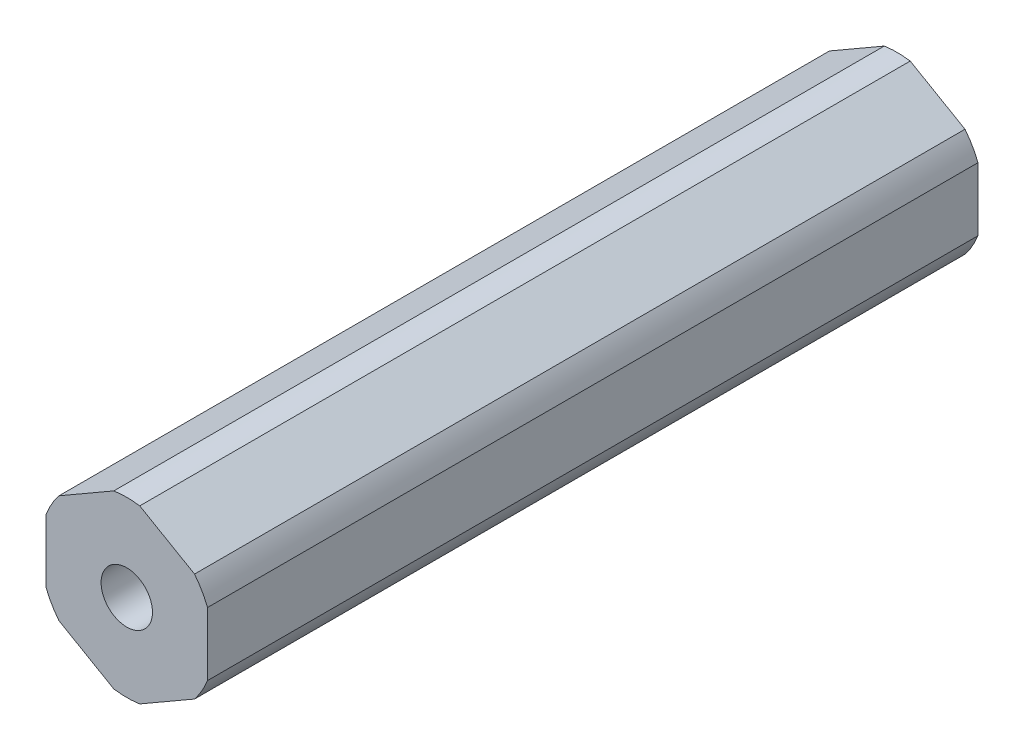
ISO-10303-21;
HEADER;
FILE_DESCRIPTION(('STEP AP214'),'2;1');
FILE_NAME('part.step','',(''),(''),'','','');
FILE_SCHEMA(('AUTOMOTIVE_DESIGN { 1 0 10303 214 1 1 1 1 }'));
ENDSEC;
DATA;
#1=APPLICATION_CONTEXT('core data for automotive mechanical design processes');
#2=APPLICATION_PROTOCOL_DEFINITION('international standard','automotive_design',2000,#1);
#3=PRODUCT_CONTEXT('',#1,'mechanical');
#4=PRODUCT('Part','Part','',(#3));
#5=PRODUCT_RELATED_PRODUCT_CATEGORY('part','',(#4));
#6=PRODUCT_DEFINITION_FORMATION('','',#4);
#7=PRODUCT_DEFINITION_CONTEXT('part definition',#1,'design');
#8=PRODUCT_DEFINITION('design','',#6,#7);
#9=PRODUCT_DEFINITION_SHAPE('','',#8);
#10=(LENGTH_UNIT() NAMED_UNIT(*) SI_UNIT(.MILLI.,.METRE.));
#11=(NAMED_UNIT(*) PLANE_ANGLE_UNIT() SI_UNIT($,.RADIAN.));
#12=(NAMED_UNIT(*) SI_UNIT($,.STERADIAN.) SOLID_ANGLE_UNIT());
#13=UNCERTAINTY_MEASURE_WITH_UNIT(LENGTH_MEASURE(1.E-05),#10,'distance_accuracy_value','');
#14=(GEOMETRIC_REPRESENTATION_CONTEXT(3) GLOBAL_UNCERTAINTY_ASSIGNED_CONTEXT((#13)) GLOBAL_UNIT_ASSIGNED_CONTEXT((#10,
#11,#12)) REPRESENTATION_CONTEXT('',''));
#15=CARTESIAN_POINT('',(0.,0.,0.));
#16=DIRECTION('',(0.,0.,1.));
#17=DIRECTION('',(1.,0.,0.));
#18=AXIS2_PLACEMENT_3D('',#15,#16,#17);
#19=CARTESIAN_POINT('',(6.35,0.,30.2895));
#20=DIRECTION('',(-1.,0.,0.));
#21=DIRECTION('',(0.,0.,1.));
#22=AXIS2_PLACEMENT_3D('',#19,#20,#21);
#23=PLANE('',#22);
#24=DIRECTION('',(0.,1.,0.));
#25=VECTOR('',#24,1.);
#26=CARTESIAN_POINT('',(6.35,0.,-30.2895));
#27=LINE('',#26,#25);
#28=CARTESIAN_POINT('',(6.35,-2.48767682989571,-30.2895));
#29=VERTEX_POINT('',#28);
#30=CARTESIAN_POINT('',(6.35,2.48767682989571,-30.2895));
#31=VERTEX_POINT('',#30);
#32=EDGE_CURVE('E177',#29,#31,#27,.T.);
#33=ORIENTED_EDGE('',*,*,#32,.T.);
#34=DIRECTION('',(0.,0.,-1.));
#35=VECTOR('',#34,1.);
#36=CARTESIAN_POINT('',(6.35,2.48767682989571,30.2895));
#37=LINE('',#36,#35);
#38=CARTESIAN_POINT('',(6.35,2.48767682989571,30.2895));
#39=VERTEX_POINT('',#38);
#40=EDGE_CURVE('E11',#39,#31,#37,.T.);
#41=ORIENTED_EDGE('',*,*,#40,.F.);
#42=DIRECTION('',(0.,1.,0.));
#43=VECTOR('',#42,1.);
#44=CARTESIAN_POINT('',(6.35,0.,30.2895));
#45=LINE('',#44,#43);
#46=CARTESIAN_POINT('',(6.35,-2.48767682989571,30.2895));
#47=VERTEX_POINT('',#46);
#48=EDGE_CURVE('E235',#47,#39,#45,.T.);
#49=ORIENTED_EDGE('',*,*,#48,.F.);
#50=DIRECTION('',(0.,0.,-1.));
#51=VECTOR('',#50,1.);
#52=CARTESIAN_POINT('',(6.35,-2.48767682989571,30.2895));
#53=LINE('',#52,#51);
#54=EDGE_CURVE('E173',#47,#29,#53,.T.);
#55=ORIENTED_EDGE('',*,*,#54,.T.);
#56=EDGE_LOOP('',(#33,#41,#49,#55));
#57=FACE_BOUND('',#56,.T.);
#58=ADVANCED_FACE('F53',(#57),#23,.F.);
#59=CARTESIAN_POINT('',(0.,0.,30.2895));
#60=DIRECTION('',(0.,0.,-1.));
#61=DIRECTION('',(-1.,0.,0.));
#62=AXIS2_PLACEMENT_3D('',#59,#60,#61);
#63=CYLINDRICAL_SURFACE('',#62,6.8199);
#64=CARTESIAN_POINT('',(0.,0.,-30.2895));
#65=DIRECTION('',(0.,0.,1.));
#66=DIRECTION('',(1.,0.,0.));
#67=AXIS2_PLACEMENT_3D('',#64,#65,#66);
#68=CIRCLE('',#67,6.8199);
#69=CARTESIAN_POINT('',(5.32939133109563,4.25542289908333,-30.2895));
#70=VERTEX_POINT('',#69);
#71=EDGE_CURVE('E180',#31,#70,#68,.T.);
#72=ORIENTED_EDGE('',*,*,#71,.T.);
#73=DIRECTION('',(0.,0.,-1.));
#74=VECTOR('',#73,1.);
#75=CARTESIAN_POINT('',(5.32939133109563,4.25542289908333,30.2895));
#76=LINE('',#75,#74);
#77=CARTESIAN_POINT('',(5.32939133109563,4.25542289908333,30.2895));
#78=VERTEX_POINT('',#77);
#79=EDGE_CURVE('E61',#78,#70,#76,.T.);
#80=ORIENTED_EDGE('',*,*,#79,.F.);
#81=CARTESIAN_POINT('',(0.,0.,30.2895));
#82=DIRECTION('',(0.,0.,1.));
#83=DIRECTION('',(1.,0.,0.));
#84=AXIS2_PLACEMENT_3D('',#81,#82,#83);
#85=CIRCLE('',#84,6.8199);
#86=EDGE_CURVE('E125',#39,#78,#85,.T.);
#87=ORIENTED_EDGE('',*,*,#86,.F.);
#88=ORIENTED_EDGE('',*,*,#40,.T.);
#89=EDGE_LOOP('',(#72,#80,#87,#88));
#90=FACE_BOUND('',#89,.T.);
#91=ADVANCED_FACE('F269',(#90),#63,.T.);
#92=CARTESIAN_POINT('',(3.175,5.49926131403119,30.2895));
#93=DIRECTION('',(-0.5,-0.866025403784438,0.));
#94=DIRECTION('',(0.866025403784439,-0.5,0.));
#95=AXIS2_PLACEMENT_3D('',#92,#93,#94);
#96=PLANE('',#95);
#97=DIRECTION('',(-0.866025403784439,0.5,0.));
#98=VECTOR('',#97,1.);
#99=CARTESIAN_POINT('',(3.175,5.49926131403119,-30.2895));
#100=LINE('',#99,#98);
#101=CARTESIAN_POINT('',(1.02060866890438,6.74309972897904,-30.2895));
#102=VERTEX_POINT('',#101);
#103=EDGE_CURVE('E183',#70,#102,#100,.T.);
#104=ORIENTED_EDGE('',*,*,#103,.T.);
#105=DIRECTION('',(0.,0.,-1.));
#106=VECTOR('',#105,1.);
#107=CARTESIAN_POINT('',(1.02060866890438,6.74309972897904,30.2895));
#108=LINE('',#107,#106);
#109=CARTESIAN_POINT('',(1.02060866890438,6.74309972897904,30.2895));
#110=VERTEX_POINT('',#109);
#111=EDGE_CURVE('E213',#110,#102,#108,.T.);
#112=ORIENTED_EDGE('',*,*,#111,.F.);
#113=DIRECTION('',(-0.866025403784439,0.5,0.));
#114=VECTOR('',#113,1.);
#115=CARTESIAN_POINT('',(3.175,5.49926131403119,30.2895));
#116=LINE('',#115,#114);
#117=EDGE_CURVE('E221',#78,#110,#116,.T.);
#118=ORIENTED_EDGE('',*,*,#117,.F.);
#119=ORIENTED_EDGE('',*,*,#79,.T.);
#120=EDGE_LOOP('',(#104,#112,#118,#119));
#121=FACE_BOUND('',#120,.T.);
#122=ADVANCED_FACE('F219',(#121),#96,.F.);
#123=CARTESIAN_POINT('',(-1.02060866890437,6.74309972897904,-30.2895));
#124=VERTEX_POINT('',#123);
#125=EDGE_CURVE('E184',#102,#124,#68,.T.);
#126=ORIENTED_EDGE('',*,*,#125,.T.);
#127=DIRECTION('',(0.,0.,-1.));
#128=VECTOR('',#127,1.);
#129=CARTESIAN_POINT('',(-1.02060866890437,6.74309972897904,30.2895));
#130=LINE('',#129,#128);
#131=CARTESIAN_POINT('',(-1.02060866890437,6.74309972897904,30.2895));
#132=VERTEX_POINT('',#131);
#133=EDGE_CURVE('E210',#132,#124,#130,.T.);
#134=ORIENTED_EDGE('',*,*,#133,.F.);
#135=EDGE_CURVE('E239',#110,#132,#85,.T.);
#136=ORIENTED_EDGE('',*,*,#135,.F.);
#137=ORIENTED_EDGE('',*,*,#111,.T.);
#138=EDGE_LOOP('',(#126,#134,#136,#137));
#139=FACE_BOUND('',#138,.T.);
#140=ADVANCED_FACE('F253',(#139),#63,.T.);
#141=CARTESIAN_POINT('',(-3.175,5.49926131403118,30.2895));
#142=DIRECTION('',(0.5,-0.866025403784438,0.));
#143=DIRECTION('',(0.866025403784439,0.5,0.));
#144=AXIS2_PLACEMENT_3D('',#141,#142,#143);
#145=PLANE('',#144);
#146=DIRECTION('',(-0.866025403784438,-0.5,0.));
#147=VECTOR('',#146,1.);
#148=CARTESIAN_POINT('',(-3.175,5.49926131403118,-30.2895));
#149=LINE('',#148,#147);
#150=CARTESIAN_POINT('',(-5.32939133109563,4.25542289908332,-30.2895));
#151=VERTEX_POINT('',#150);
#152=EDGE_CURVE('E186',#124,#151,#149,.T.);
#153=ORIENTED_EDGE('',*,*,#152,.T.);
#154=DIRECTION('',(0.,0.,-1.));
#155=VECTOR('',#154,1.);
#156=CARTESIAN_POINT('',(-5.32939133109563,4.25542289908332,30.2895));
#157=LINE('',#156,#155);
#158=CARTESIAN_POINT('',(-5.32939133109563,4.25542289908332,30.2895));
#159=VERTEX_POINT('',#158);
#160=EDGE_CURVE('E207',#159,#151,#157,.T.);
#161=ORIENTED_EDGE('',*,*,#160,.F.);
#162=DIRECTION('',(-0.866025403784438,-0.5,0.));
#163=VECTOR('',#162,1.);
#164=CARTESIAN_POINT('',(-3.175,5.49926131403118,30.2895));
#165=LINE('',#164,#163);
#166=EDGE_CURVE('E244',#132,#159,#165,.T.);
#167=ORIENTED_EDGE('',*,*,#166,.F.);
#168=ORIENTED_EDGE('',*,*,#133,.T.);
#169=EDGE_LOOP('',(#153,#161,#167,#168));
#170=FACE_BOUND('',#169,.T.);
#171=ADVANCED_FACE('F255',(#170),#145,.F.);
#172=CARTESIAN_POINT('',(-6.35,2.48767682989571,-30.2895));
#173=VERTEX_POINT('',#172);
#174=EDGE_CURVE('E188',#151,#173,#68,.T.);
#175=ORIENTED_EDGE('',*,*,#174,.T.);
#176=DIRECTION('',(0.,0.,-1.));
#177=VECTOR('',#176,1.);
#178=CARTESIAN_POINT('',(-6.35,2.48767682989571,30.2895));
#179=LINE('',#178,#177);
#180=CARTESIAN_POINT('',(-6.35,2.48767682989571,30.2895));
#181=VERTEX_POINT('',#180);
#182=EDGE_CURVE('E204',#181,#173,#179,.T.);
#183=ORIENTED_EDGE('',*,*,#182,.F.);
#184=EDGE_CURVE('E245',#159,#181,#85,.T.);
#185=ORIENTED_EDGE('',*,*,#184,.F.);
#186=ORIENTED_EDGE('',*,*,#160,.T.);
#187=EDGE_LOOP('',(#175,#183,#185,#186));
#188=FACE_BOUND('',#187,.T.);
#189=ADVANCED_FACE('F256',(#188),#63,.T.);
#190=CARTESIAN_POINT('',(-6.35,0.,30.2895));
#191=DIRECTION('',(1.,0.,0.));
#192=DIRECTION('',(0.,1.,0.));
#193=AXIS2_PLACEMENT_3D('',#190,#191,#192);
#194=PLANE('',#193);
#195=DIRECTION('',(0.,-1.,0.));
#196=VECTOR('',#195,1.);
#197=CARTESIAN_POINT('',(-6.35,0.,-30.2895));
#198=LINE('',#197,#196);
#199=CARTESIAN_POINT('',(-6.35,-2.48767682989572,-30.2895));
#200=VERTEX_POINT('',#199);
#201=EDGE_CURVE('E189',#173,#200,#198,.T.);
#202=ORIENTED_EDGE('',*,*,#201,.T.);
#203=DIRECTION('',(0.,0.,-1.));
#204=VECTOR('',#203,1.);
#205=CARTESIAN_POINT('',(-6.35,-2.48767682989572,30.2895));
#206=LINE('',#205,#204);
#207=CARTESIAN_POINT('',(-6.35,-2.48767682989572,30.2895));
#208=VERTEX_POINT('',#207);
#209=EDGE_CURVE('E201',#208,#200,#206,.T.);
#210=ORIENTED_EDGE('',*,*,#209,.F.);
#211=DIRECTION('',(0.,-1.,0.));
#212=VECTOR('',#211,1.);
#213=CARTESIAN_POINT('',(-6.35,0.,30.2895));
#214=LINE('',#213,#212);
#215=EDGE_CURVE('E246',#181,#208,#214,.T.);
#216=ORIENTED_EDGE('',*,*,#215,.F.);
#217=ORIENTED_EDGE('',*,*,#182,.T.);
#218=EDGE_LOOP('',(#202,#210,#216,#217));
#219=FACE_BOUND('',#218,.T.);
#220=ADVANCED_FACE('F259',(#219),#194,.F.);
#221=CARTESIAN_POINT('',(-5.32939133109563,-4.25542289908334,-30.2895));
#222=VERTEX_POINT('',#221);
#223=EDGE_CURVE('E191',#200,#222,#68,.T.);
#224=ORIENTED_EDGE('',*,*,#223,.T.);
#225=DIRECTION('',(0.,0.,-1.));
#226=VECTOR('',#225,1.);
#227=CARTESIAN_POINT('',(-5.32939133109563,-4.25542289908334,30.2895));
#228=LINE('',#227,#226);
#229=CARTESIAN_POINT('',(-5.32939133109563,-4.25542289908334,30.2895));
#230=VERTEX_POINT('',#229);
#231=EDGE_CURVE('E198',#230,#222,#228,.T.);
#232=ORIENTED_EDGE('',*,*,#231,.F.);
#233=EDGE_CURVE('E163',#208,#230,#85,.T.);
#234=ORIENTED_EDGE('',*,*,#233,.F.);
#235=ORIENTED_EDGE('',*,*,#209,.T.);
#236=EDGE_LOOP('',(#224,#232,#234,#235));
#237=FACE_BOUND('',#236,.T.);
#238=ADVANCED_FACE('F261',(#237),#63,.T.);
#239=CARTESIAN_POINT('',(-3.175,-5.49926131403119,30.2895));
#240=DIRECTION('',(0.5,0.866025403784439,0.));
#241=DIRECTION('',(-0.866025403784439,0.5,0.));
#242=AXIS2_PLACEMENT_3D('',#239,#240,#241);
#243=PLANE('',#242);
#244=DIRECTION('',(0.866025403784439,-0.5,0.));
#245=VECTOR('',#244,1.);
#246=CARTESIAN_POINT('',(-3.175,-5.49926131403119,-30.2895));
#247=LINE('',#246,#245);
#248=CARTESIAN_POINT('',(-1.02060866890438,-6.74309972897904,-30.2895));
#249=VERTEX_POINT('',#248);
#250=EDGE_CURVE('E192',#222,#249,#247,.T.);
#251=ORIENTED_EDGE('',*,*,#250,.T.);
#252=DIRECTION('',(0.,0.,-1.));
#253=VECTOR('',#252,1.);
#254=CARTESIAN_POINT('',(-1.02060866890438,-6.74309972897904,30.2895));
#255=LINE('',#254,#253);
#256=CARTESIAN_POINT('',(-1.02060866890438,-6.74309972897904,30.2895));
#257=VERTEX_POINT('',#256);
#258=EDGE_CURVE('E168',#257,#249,#255,.T.);
#259=ORIENTED_EDGE('',*,*,#258,.F.);
#260=DIRECTION('',(0.866025403784439,-0.5,0.));
#261=VECTOR('',#260,1.);
#262=CARTESIAN_POINT('',(-3.175,-5.49926131403119,30.2895));
#263=LINE('',#262,#261);
#264=EDGE_CURVE('E158',#230,#257,#263,.T.);
#265=ORIENTED_EDGE('',*,*,#264,.F.);
#266=ORIENTED_EDGE('',*,*,#231,.T.);
#267=EDGE_LOOP('',(#251,#259,#265,#266));
#268=FACE_BOUND('',#267,.T.);
#269=ADVANCED_FACE('F264',(#268),#243,.F.);
#270=CARTESIAN_POINT('',(1.02060866890438,-6.74309972897904,-30.2895));
#271=VERTEX_POINT('',#270);
#272=EDGE_CURVE('E167',#249,#271,#68,.T.);
#273=ORIENTED_EDGE('',*,*,#272,.T.);
#274=DIRECTION('',(0.,0.,-1.));
#275=VECTOR('',#274,1.);
#276=CARTESIAN_POINT('',(1.02060866890438,-6.74309972897904,30.2895));
#277=LINE('',#276,#275);
#278=CARTESIAN_POINT('',(1.02060866890438,-6.74309972897904,30.2895));
#279=VERTEX_POINT('',#278);
#280=EDGE_CURVE('E164',#279,#271,#277,.T.);
#281=ORIENTED_EDGE('',*,*,#280,.F.);
#282=EDGE_CURVE('E152',#257,#279,#85,.T.);
#283=ORIENTED_EDGE('',*,*,#282,.F.);
#284=ORIENTED_EDGE('',*,*,#258,.T.);
#285=EDGE_LOOP('',(#273,#281,#283,#284));
#286=FACE_BOUND('',#285,.T.);
#287=ADVANCED_FACE('F165',(#286),#63,.T.);
#288=CARTESIAN_POINT('',(3.175,-5.49926131403119,30.2895));
#289=DIRECTION('',(-0.5,0.866025403784438,0.));
#290=DIRECTION('',(-0.866025403784439,-0.5,0.));
#291=AXIS2_PLACEMENT_3D('',#288,#289,#290);
#292=PLANE('',#291);
#293=DIRECTION('',(0.866025403784438,0.5,0.));
#294=VECTOR('',#293,1.);
#295=CARTESIAN_POINT('',(3.175,-5.49926131403119,-30.2895));
#296=LINE('',#295,#294);
#297=CARTESIAN_POINT('',(5.32939133109563,-4.25542289908333,-30.2895));
#298=VERTEX_POINT('',#297);
#299=EDGE_CURVE('E111',#271,#298,#296,.T.);
#300=ORIENTED_EDGE('',*,*,#299,.T.);
#301=DIRECTION('',(0.,0.,-1.));
#302=VECTOR('',#301,1.);
#303=CARTESIAN_POINT('',(5.32939133109563,-4.25542289908333,30.2895));
#304=LINE('',#303,#302);
#305=CARTESIAN_POINT('',(5.32939133109563,-4.25542289908333,30.2895));
#306=VERTEX_POINT('',#305);
#307=EDGE_CURVE('E169',#306,#298,#304,.T.);
#308=ORIENTED_EDGE('',*,*,#307,.F.);
#309=DIRECTION('',(0.866025403784438,0.5,0.));
#310=VECTOR('',#309,1.);
#311=CARTESIAN_POINT('',(3.175,-5.49926131403119,30.2895));
#312=LINE('',#311,#310);
#313=EDGE_CURVE('E156',#279,#306,#312,.T.);
#314=ORIENTED_EDGE('',*,*,#313,.F.);
#315=ORIENTED_EDGE('',*,*,#280,.T.);
#316=EDGE_LOOP('',(#300,#308,#314,#315));
#317=FACE_BOUND('',#316,.T.);
#318=ADVANCED_FACE('F171',(#317),#292,.F.);
#319=EDGE_CURVE('E117',#298,#29,#68,.T.);
#320=ORIENTED_EDGE('',*,*,#319,.T.);
#321=ORIENTED_EDGE('',*,*,#54,.F.);
#322=EDGE_CURVE('E69',#306,#47,#85,.T.);
#323=ORIENTED_EDGE('',*,*,#322,.F.);
#324=ORIENTED_EDGE('',*,*,#307,.T.);
#325=EDGE_LOOP('',(#320,#321,#323,#324));
#326=FACE_BOUND('',#325,.T.);
#327=ADVANCED_FACE('F266',(#326),#63,.T.);
#328=CARTESIAN_POINT('',(0.,0.,30.2895));
#329=DIRECTION('',(0.,0.,1.));
#330=DIRECTION('',(1.,0.,0.));
#331=AXIS2_PLACEMENT_3D('',#328,#329,#330);
#332=PLANE('',#331);
#333=CARTESIAN_POINT('',(0.,0.,30.2895));
#334=DIRECTION('',(0.,0.,1.));
#335=DIRECTION('',(1.,0.,0.));
#336=AXIS2_PLACEMENT_3D('',#333,#334,#335);
#337=CIRCLE('',#336,2.01929999999999);
#338=CARTESIAN_POINT('',(2.01929999999999,0.,30.2895));
#339=VERTEX_POINT('',#338);
#340=EDGE_CURVE('E443',#339,#339,#337,.T.);
#341=ORIENTED_EDGE('',*,*,#340,.F.);
#342=EDGE_LOOP('',(#341));
#343=FACE_BOUND('',#342,.T.);
#344=ORIENTED_EDGE('',*,*,#48,.T.);
#345=ORIENTED_EDGE('',*,*,#86,.T.);
#346=ORIENTED_EDGE('',*,*,#117,.T.);
#347=ORIENTED_EDGE('',*,*,#135,.T.);
#348=ORIENTED_EDGE('',*,*,#166,.T.);
#349=ORIENTED_EDGE('',*,*,#184,.T.);
#350=ORIENTED_EDGE('',*,*,#215,.T.);
#351=ORIENTED_EDGE('',*,*,#233,.T.);
#352=ORIENTED_EDGE('',*,*,#264,.T.);
#353=ORIENTED_EDGE('',*,*,#282,.T.);
#354=ORIENTED_EDGE('',*,*,#313,.T.);
#355=ORIENTED_EDGE('',*,*,#322,.T.);
#356=EDGE_LOOP('',(#344,#345,#346,#347,#348,#349,#350,#351,#352,#353,#354,#355));
#357=FACE_BOUND('',#356,.T.);
#358=ADVANCED_FACE('F154',(#343,#357),#332,.T.);
#359=CARTESIAN_POINT('',(0.,0.,-30.2895));
#360=DIRECTION('',(0.,0.,1.));
#361=DIRECTION('',(1.,0.,0.));
#362=AXIS2_PLACEMENT_3D('',#359,#360,#361);
#363=PLANE('',#362);
#364=CARTESIAN_POINT('',(0.,0.,-30.2895));
#365=DIRECTION('',(0.,0.,-1.));
#366=DIRECTION('',(-1.,0.,0.));
#367=AXIS2_PLACEMENT_3D('',#364,#365,#366);
#368=CIRCLE('',#367,2.01929999999999);
#369=CARTESIAN_POINT('',(-2.01929999999999,0.,-30.2895));
#370=VERTEX_POINT('',#369);
#371=EDGE_CURVE('E441',#370,#370,#368,.T.);
#372=ORIENTED_EDGE('',*,*,#371,.F.);
#373=EDGE_LOOP('',(#372));
#374=FACE_BOUND('',#373,.T.);
#375=ORIENTED_EDGE('',*,*,#32,.F.);
#376=ORIENTED_EDGE('',*,*,#319,.F.);
#377=ORIENTED_EDGE('',*,*,#299,.F.);
#378=ORIENTED_EDGE('',*,*,#272,.F.);
#379=ORIENTED_EDGE('',*,*,#250,.F.);
#380=ORIENTED_EDGE('',*,*,#223,.F.);
#381=ORIENTED_EDGE('',*,*,#201,.F.);
#382=ORIENTED_EDGE('',*,*,#174,.F.);
#383=ORIENTED_EDGE('',*,*,#152,.F.);
#384=ORIENTED_EDGE('',*,*,#125,.F.);
#385=ORIENTED_EDGE('',*,*,#103,.F.);
#386=ORIENTED_EDGE('',*,*,#71,.F.);
#387=EDGE_LOOP('',(#375,#376,#377,#378,#379,#380,#381,#382,#383,#384,#385,#386));
#388=FACE_BOUND('',#387,.T.);
#389=ADVANCED_FACE('F225',(#374,#388),#363,.F.);
#390=CARTESIAN_POINT('',(0.,0.,18.26006));
#391=DIRECTION('',(0.,0.,1.));
#392=DIRECTION('',(1.,0.,0.));
#393=AXIS2_PLACEMENT_3D('',#390,#391,#392);
#394=CONICAL_SURFACE('',#393,2.01929999999999,1.02974425867665);
#395=CARTESIAN_POINT('',(0.,0.,17.0467421519976));
#396=VERTEX_POINT('',#395);
#397=VERTEX_LOOP('',#396);
#398=FACE_BOUND('',#397,.T.);
#399=CARTESIAN_POINT('',(0.,0.,18.26006));
#400=DIRECTION('',(0.,0.,1.));
#401=DIRECTION('',(1.,0.,0.));
#402=AXIS2_PLACEMENT_3D('',#399,#400,#401);
#403=CIRCLE('',#402,2.01929999999999);
#404=CARTESIAN_POINT('',(2.01929999999999,0.,18.26006));
#405=VERTEX_POINT('',#404);
#406=EDGE_CURVE('E181',#405,#405,#403,.T.);
#407=ORIENTED_EDGE('',*,*,#406,.T.);
#408=EDGE_LOOP('',(#407));
#409=FACE_BOUND('',#408,.T.);
#410=ADVANCED_FACE('F367',(#398,#409),#394,.F.);
#411=CARTESIAN_POINT('',(0.,0.,30.2895));
#412=DIRECTION('',(0.,0.,1.));
#413=DIRECTION('',(1.,0.,0.));
#414=AXIS2_PLACEMENT_3D('',#411,#412,#413);
#415=CYLINDRICAL_SURFACE('',#414,2.01929999999999);
#416=ORIENTED_EDGE('',*,*,#406,.F.);
#417=EDGE_LOOP('',(#416));
#418=FACE_BOUND('',#417,.T.);
#419=ORIENTED_EDGE('',*,*,#340,.T.);
#420=EDGE_LOOP('',(#419));
#421=FACE_BOUND('',#420,.T.);
#422=ADVANCED_FACE('F378',(#418,#421),#415,.F.);
#423=CARTESIAN_POINT('',(0.,0.,-18.26006));
#424=DIRECTION('',(0.,0.,-1.));
#425=DIRECTION('',(-1.,0.,0.));
#426=AXIS2_PLACEMENT_3D('',#423,#424,#425);
#427=CONICAL_SURFACE('',#426,2.01929999999999,1.02974425867665);
#428=CARTESIAN_POINT('',(0.,0.,-17.0467421519976));
#429=VERTEX_POINT('',#428);
#430=VERTEX_LOOP('',#429);
#431=FACE_BOUND('',#430,.T.);
#432=CARTESIAN_POINT('',(0.,0.,-18.26006));
#433=DIRECTION('',(0.,0.,-1.));
#434=DIRECTION('',(-1.,0.,0.));
#435=AXIS2_PLACEMENT_3D('',#432,#433,#434);
#436=CIRCLE('',#435,2.01929999999999);
#437=CARTESIAN_POINT('',(-2.01929999999999,0.,-18.26006));
#438=VERTEX_POINT('',#437);
#439=EDGE_CURVE('E438',#438,#438,#436,.T.);
#440=ORIENTED_EDGE('',*,*,#439,.T.);
#441=EDGE_LOOP('',(#440));
#442=FACE_BOUND('',#441,.T.);
#443=ADVANCED_FACE('F388',(#431,#442),#427,.F.);
#444=CARTESIAN_POINT('',(0.,0.,-30.2895));
#445=DIRECTION('',(0.,0.,-1.));
#446=DIRECTION('',(-1.,0.,0.));
#447=AXIS2_PLACEMENT_3D('',#444,#445,#446);
#448=CYLINDRICAL_SURFACE('',#447,2.01929999999999);
#449=ORIENTED_EDGE('',*,*,#439,.F.);
#450=EDGE_LOOP('',(#449));
#451=FACE_BOUND('',#450,.T.);
#452=ORIENTED_EDGE('',*,*,#371,.T.);
#453=EDGE_LOOP('',(#452));
#454=FACE_BOUND('',#453,.T.);
#455=ADVANCED_FACE('F398',(#451,#454),#448,.F.);
#456=CLOSED_SHELL('',(#58,#91,#122,#140,#171,#189,#220,#238,#269,#287,#318,#327,#358,#389,#410,
#422,#443,#455));
#457=MANIFOLD_SOLID_BREP('B2',#456);
#458=ADVANCED_BREP_SHAPE_REPRESENTATION('',(#18,#457),#14);
#459=SHAPE_DEFINITION_REPRESENTATION(#9,#458);
ENDSEC;
END-ISO-10303-21;
